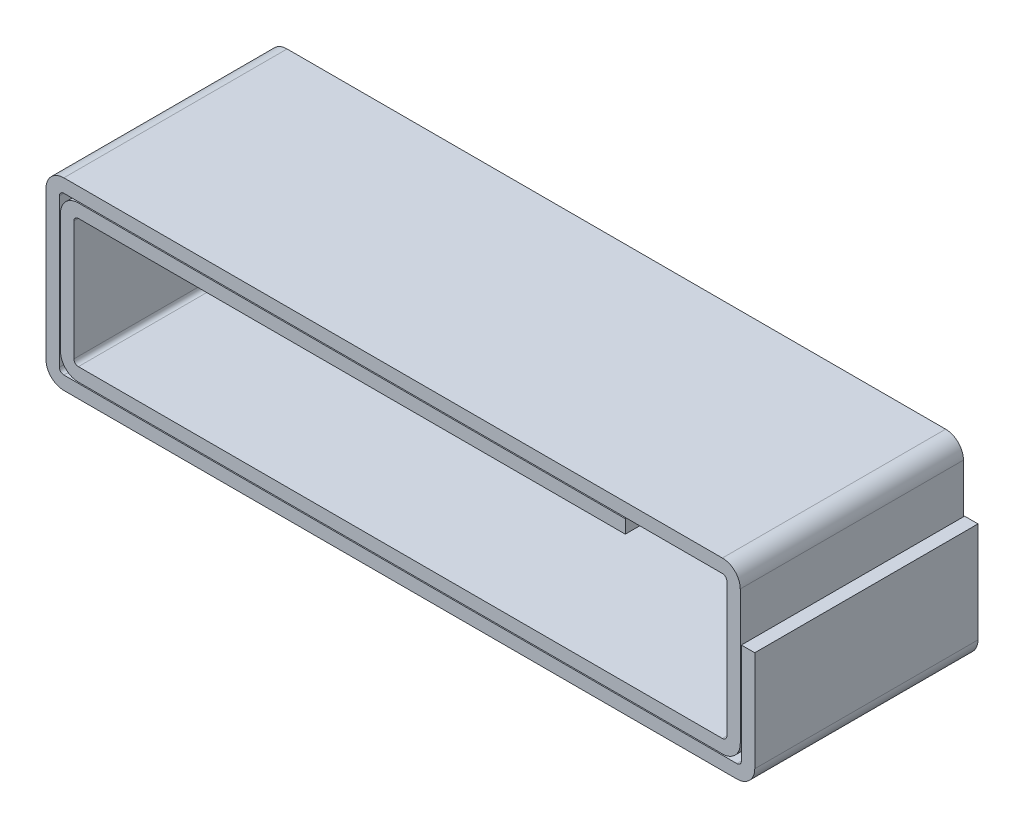
ISO-10303-21;
HEADER;
FILE_DESCRIPTION(('STEP AP214'),'2;1');
FILE_NAME('part.step','',(''),(''),'','','');
FILE_SCHEMA(('AUTOMOTIVE_DESIGN { 1 0 10303 214 1 1 1 1 }'));
ENDSEC;
DATA;
#1=APPLICATION_CONTEXT('core data for automotive mechanical design processes');
#2=APPLICATION_PROTOCOL_DEFINITION('international standard','automotive_design',2000,#1);
#3=PRODUCT_CONTEXT('',#1,'mechanical');
#4=PRODUCT('Part','Part','',(#3));
#5=PRODUCT_RELATED_PRODUCT_CATEGORY('part','',(#4));
#6=PRODUCT_DEFINITION_FORMATION('','',#4);
#7=PRODUCT_DEFINITION_CONTEXT('part definition',#1,'design');
#8=PRODUCT_DEFINITION('design','',#6,#7);
#9=PRODUCT_DEFINITION_SHAPE('','',#8);
#10=(LENGTH_UNIT() NAMED_UNIT(*) SI_UNIT(.MILLI.,.METRE.));
#11=(NAMED_UNIT(*) PLANE_ANGLE_UNIT() SI_UNIT($,.RADIAN.));
#12=(NAMED_UNIT(*) SI_UNIT($,.STERADIAN.) SOLID_ANGLE_UNIT());
#13=UNCERTAINTY_MEASURE_WITH_UNIT(LENGTH_MEASURE(1.E-05),#10,'distance_accuracy_value','');
#14=(GEOMETRIC_REPRESENTATION_CONTEXT(3) GLOBAL_UNCERTAINTY_ASSIGNED_CONTEXT((#13)) GLOBAL_UNIT_ASSIGNED_CONTEXT((#10,
#11,#12)) REPRESENTATION_CONTEXT('',''));
#15=CARTESIAN_POINT('',(0.,0.,0.));
#16=DIRECTION('',(0.,0.,1.));
#17=DIRECTION('',(1.,0.,0.));
#18=AXIS2_PLACEMENT_3D('',#15,#16,#17);
#19=CARTESIAN_POINT('',(28.85,12.9999999999999,10.));
#20=DIRECTION('',(0.,0.,-1.));
#21=DIRECTION('',(-1.,0.,0.));
#22=AXIS2_PLACEMENT_3D('',#19,#20,#21);
#23=CYLINDRICAL_SURFACE('',#22,1.6);
#24=CARTESIAN_POINT('',(28.85,12.9999999999999,-10.));
#25=DIRECTION('',(0.,0.,1.));
#26=DIRECTION('',(1.,0.,0.));
#27=AXIS2_PLACEMENT_3D('',#24,#25,#26);
#28=CIRCLE('',#27,1.6);
#29=CARTESIAN_POINT('',(30.45,13.,-10.));
#30=VERTEX_POINT('',#29);
#31=CARTESIAN_POINT('',(28.85,14.5999999999999,-10.));
#32=VERTEX_POINT('',#31);
#33=EDGE_CURVE('E290',#30,#32,#28,.T.);
#34=ORIENTED_EDGE('',*,*,#33,.T.);
#35=DIRECTION('',(0.,0.,-1.));
#36=VECTOR('',#35,1.);
#37=CARTESIAN_POINT('',(28.85,14.5999999999999,10.));
#38=LINE('',#37,#36);
#39=CARTESIAN_POINT('',(28.85,14.5999999999999,10.));
#40=VERTEX_POINT('',#39);
#41=EDGE_CURVE('E11',#40,#32,#38,.T.);
#42=ORIENTED_EDGE('',*,*,#41,.F.);
#43=CARTESIAN_POINT('',(28.85,12.9999999999999,10.));
#44=DIRECTION('',(0.,0.,1.));
#45=DIRECTION('',(1.,0.,0.));
#46=AXIS2_PLACEMENT_3D('',#43,#44,#45);
#47=CIRCLE('',#46,1.6);
#48=CARTESIAN_POINT('',(30.45,13.,10.));
#49=VERTEX_POINT('',#48);
#50=EDGE_CURVE('E403',#49,#40,#47,.T.);
#51=ORIENTED_EDGE('',*,*,#50,.F.);
#52=DIRECTION('',(0.,0.,-1.));
#53=VECTOR('',#52,1.);
#54=CARTESIAN_POINT('',(30.45,13.,10.));
#55=LINE('',#54,#53);
#56=EDGE_CURVE('E286',#49,#30,#55,.T.);
#57=ORIENTED_EDGE('',*,*,#56,.T.);
#58=EDGE_LOOP('',(#34,#42,#51,#57));
#59=FACE_BOUND('',#58,.T.);
#60=ADVANCED_FACE('F45',(#59),#23,.T.);
#61=CARTESIAN_POINT('',(28.85,14.5999999999999,10.));
#62=DIRECTION('',(0.,-1.,0.));
#63=DIRECTION('',(1.,0.,0.));
#64=AXIS2_PLACEMENT_3D('',#61,#62,#63);
#65=PLANE('',#64);
#66=DIRECTION('',(-1.,0.,0.));
#67=VECTOR('',#66,1.);
#68=CARTESIAN_POINT('',(28.85,14.5999999999999,-10.));
#69=LINE('',#68,#67);
#70=CARTESIAN_POINT('',(-30.15,14.5999999999999,-10.));
#71=VERTEX_POINT('',#70);
#72=EDGE_CURVE('E294',#32,#71,#69,.T.);
#73=ORIENTED_EDGE('',*,*,#72,.T.);
#74=DIRECTION('',(0.,0.,-1.));
#75=VECTOR('',#74,1.);
#76=CARTESIAN_POINT('',(-30.15,14.5999999999999,10.));
#77=LINE('',#76,#75);
#78=CARTESIAN_POINT('',(-30.15,14.5999999999999,10.));
#79=VERTEX_POINT('',#78);
#80=EDGE_CURVE('E54',#79,#71,#77,.T.);
#81=ORIENTED_EDGE('',*,*,#80,.F.);
#82=DIRECTION('',(-1.,0.,0.));
#83=VECTOR('',#82,1.);
#84=CARTESIAN_POINT('',(28.85,14.5999999999999,10.));
#85=LINE('',#84,#83);
#86=EDGE_CURVE('E177',#40,#79,#85,.T.);
#87=ORIENTED_EDGE('',*,*,#86,.F.);
#88=ORIENTED_EDGE('',*,*,#41,.T.);
#89=EDGE_LOOP('',(#73,#81,#87,#88));
#90=FACE_BOUND('',#89,.T.);
#91=ADVANCED_FACE('F635',(#90),#65,.F.);
#92=CARTESIAN_POINT('',(-30.15,12.9999999999999,10.));
#93=DIRECTION('',(0.,0.,-1.));
#94=DIRECTION('',(-1.,0.,0.));
#95=AXIS2_PLACEMENT_3D('',#92,#93,#94);
#96=CYLINDRICAL_SURFACE('',#95,1.6);
#97=CARTESIAN_POINT('',(-30.15,12.9999999999999,-10.));
#98=DIRECTION('',(0.,0.,1.));
#99=DIRECTION('',(1.,0.,0.));
#100=AXIS2_PLACEMENT_3D('',#97,#98,#99);
#101=CIRCLE('',#100,1.6);
#102=CARTESIAN_POINT('',(-31.75,12.9999999999999,-10.));
#103=VERTEX_POINT('',#102);
#104=EDGE_CURVE('E297',#71,#103,#101,.T.);
#105=ORIENTED_EDGE('',*,*,#104,.T.);
#106=DIRECTION('',(0.,0.,-1.));
#107=VECTOR('',#106,1.);
#108=CARTESIAN_POINT('',(-31.75,12.9999999999999,10.));
#109=LINE('',#108,#107);
#110=CARTESIAN_POINT('',(-31.75,12.9999999999999,10.));
#111=VERTEX_POINT('',#110);
#112=EDGE_CURVE('E491',#111,#103,#109,.T.);
#113=ORIENTED_EDGE('',*,*,#112,.F.);
#114=CARTESIAN_POINT('',(-30.15,12.9999999999999,10.));
#115=DIRECTION('',(0.,0.,1.));
#116=DIRECTION('',(1.,0.,0.));
#117=AXIS2_PLACEMENT_3D('',#114,#115,#116);
#118=CIRCLE('',#117,1.6);
#119=EDGE_CURVE('E501',#79,#111,#118,.T.);
#120=ORIENTED_EDGE('',*,*,#119,.F.);
#121=ORIENTED_EDGE('',*,*,#80,.T.);
#122=EDGE_LOOP('',(#105,#113,#120,#121));
#123=FACE_BOUND('',#122,.T.);
#124=ADVANCED_FACE('F499',(#123),#96,.T.);
#125=CARTESIAN_POINT('',(-31.75,12.9999999999999,10.));
#126=DIRECTION('',(1.,0.,0.));
#127=DIRECTION('',(0.,0.,-1.));
#128=AXIS2_PLACEMENT_3D('',#125,#126,#127);
#129=PLANE('',#128);
#130=DIRECTION('',(0.,-1.,0.));
#131=VECTOR('',#130,1.);
#132=CARTESIAN_POINT('',(-31.75,12.9999999999999,-10.));
#133=LINE('',#132,#131);
#134=CARTESIAN_POINT('',(-31.75,-0.3,-10.));
#135=VERTEX_POINT('',#134);
#136=EDGE_CURVE('E300',#103,#135,#133,.T.);
#137=ORIENTED_EDGE('',*,*,#136,.T.);
#138=DIRECTION('',(0.,0.,-1.));
#139=VECTOR('',#138,1.);
#140=CARTESIAN_POINT('',(-31.75,-0.3,10.));
#141=LINE('',#140,#139);
#142=CARTESIAN_POINT('',(-31.75,-0.3,10.));
#143=VERTEX_POINT('',#142);
#144=EDGE_CURVE('E487',#143,#135,#141,.T.);
#145=ORIENTED_EDGE('',*,*,#144,.F.);
#146=DIRECTION('',(0.,-1.,0.));
#147=VECTOR('',#146,1.);
#148=CARTESIAN_POINT('',(-31.75,12.9999999999999,10.));
#149=LINE('',#148,#147);
#150=EDGE_CURVE('E520',#111,#143,#149,.T.);
#151=ORIENTED_EDGE('',*,*,#150,.F.);
#152=ORIENTED_EDGE('',*,*,#112,.T.);
#153=EDGE_LOOP('',(#137,#145,#151,#152));
#154=FACE_BOUND('',#153,.T.);
#155=ADVANCED_FACE('F510',(#154),#129,.F.);
#156=CARTESIAN_POINT('',(-30.15,-0.3,10.));
#157=DIRECTION('',(0.,0.,-1.));
#158=DIRECTION('',(-1.,0.,0.));
#159=AXIS2_PLACEMENT_3D('',#156,#157,#158);
#160=CYLINDRICAL_SURFACE('',#159,1.6);
#161=CARTESIAN_POINT('',(-30.15,-0.3,-10.));
#162=DIRECTION('',(0.,0.,1.));
#163=DIRECTION('',(1.,0.,0.));
#164=AXIS2_PLACEMENT_3D('',#161,#162,#163);
#165=CIRCLE('',#164,1.6);
#166=CARTESIAN_POINT('',(-30.15,-1.9,-10.));
#167=VERTEX_POINT('',#166);
#168=EDGE_CURVE('E303',#135,#167,#165,.T.);
#169=ORIENTED_EDGE('',*,*,#168,.T.);
#170=DIRECTION('',(0.,0.,-1.));
#171=VECTOR('',#170,1.);
#172=CARTESIAN_POINT('',(-30.15,-1.9,10.));
#173=LINE('',#172,#171);
#174=CARTESIAN_POINT('',(-30.15,-1.9,10.));
#175=VERTEX_POINT('',#174);
#176=EDGE_CURVE('E483',#175,#167,#173,.T.);
#177=ORIENTED_EDGE('',*,*,#176,.F.);
#178=CARTESIAN_POINT('',(-30.15,-0.3,10.));
#179=DIRECTION('',(0.,0.,1.));
#180=DIRECTION('',(1.,0.,0.));
#181=AXIS2_PLACEMENT_3D('',#178,#179,#180);
#182=CIRCLE('',#181,1.6);
#183=EDGE_CURVE('E516',#143,#175,#182,.T.);
#184=ORIENTED_EDGE('',*,*,#183,.F.);
#185=ORIENTED_EDGE('',*,*,#144,.T.);
#186=EDGE_LOOP('',(#169,#177,#184,#185));
#187=FACE_BOUND('',#186,.T.);
#188=ADVANCED_FACE('F514',(#187),#160,.T.);
#189=CARTESIAN_POINT('',(-30.15,-1.9,10.));
#190=DIRECTION('',(0.,1.,0.));
#191=DIRECTION('',(0.,0.,1.));
#192=AXIS2_PLACEMENT_3D('',#189,#190,#191);
#193=PLANE('',#192);
#194=DIRECTION('',(1.,0.,0.));
#195=VECTOR('',#194,1.);
#196=CARTESIAN_POINT('',(-30.15,-1.9,-10.));
#197=LINE('',#196,#195);
#198=CARTESIAN_POINT('',(30.15,-1.9,-10.));
#199=VERTEX_POINT('',#198);
#200=EDGE_CURVE('E306',#167,#199,#197,.T.);
#201=ORIENTED_EDGE('',*,*,#200,.T.);
#202=DIRECTION('',(0.,0.,-1.));
#203=VECTOR('',#202,1.);
#204=CARTESIAN_POINT('',(30.15,-1.9,10.));
#205=LINE('',#204,#203);
#206=CARTESIAN_POINT('',(30.15,-1.9,10.));
#207=VERTEX_POINT('',#206);
#208=EDGE_CURVE('E479',#207,#199,#205,.T.);
#209=ORIENTED_EDGE('',*,*,#208,.F.);
#210=DIRECTION('',(1.,0.,0.));
#211=VECTOR('',#210,1.);
#212=CARTESIAN_POINT('',(-30.15,-1.9,10.));
#213=LINE('',#212,#211);
#214=EDGE_CURVE('E519',#175,#207,#213,.T.);
#215=ORIENTED_EDGE('',*,*,#214,.F.);
#216=ORIENTED_EDGE('',*,*,#176,.T.);
#217=EDGE_LOOP('',(#201,#209,#215,#216));
#218=FACE_BOUND('',#217,.T.);
#219=ADVANCED_FACE('F648',(#218),#193,.F.);
#220=CARTESIAN_POINT('',(30.15,-0.3,10.));
#221=DIRECTION('',(0.,0.,-1.));
#222=DIRECTION('',(-1.,0.,0.));
#223=AXIS2_PLACEMENT_3D('',#220,#221,#222);
#224=CYLINDRICAL_SURFACE('',#223,1.6);
#225=CARTESIAN_POINT('',(30.15,-0.3,-10.));
#226=DIRECTION('',(0.,0.,1.));
#227=DIRECTION('',(1.,0.,0.));
#228=AXIS2_PLACEMENT_3D('',#225,#226,#227);
#229=CIRCLE('',#228,1.6);
#230=CARTESIAN_POINT('',(31.75,-0.3,-10.));
#231=VERTEX_POINT('',#230);
#232=EDGE_CURVE('E309',#199,#231,#229,.T.);
#233=ORIENTED_EDGE('',*,*,#232,.T.);
#234=DIRECTION('',(0.,0.,-1.));
#235=VECTOR('',#234,1.);
#236=CARTESIAN_POINT('',(31.75,-0.3,10.));
#237=LINE('',#236,#235);
#238=CARTESIAN_POINT('',(31.75,-0.3,10.));
#239=VERTEX_POINT('',#238);
#240=EDGE_CURVE('E475',#239,#231,#237,.T.);
#241=ORIENTED_EDGE('',*,*,#240,.F.);
#242=CARTESIAN_POINT('',(30.15,-0.3,10.));
#243=DIRECTION('',(0.,0.,1.));
#244=DIRECTION('',(1.,0.,0.));
#245=AXIS2_PLACEMENT_3D('',#242,#243,#244);
#246=CIRCLE('',#245,1.6);
#247=EDGE_CURVE('E524',#207,#239,#246,.T.);
#248=ORIENTED_EDGE('',*,*,#247,.F.);
#249=ORIENTED_EDGE('',*,*,#208,.T.);
#250=EDGE_LOOP('',(#233,#241,#248,#249));
#251=FACE_BOUND('',#250,.T.);
#252=ADVANCED_FACE('F651',(#251),#224,.T.);
#253=CARTESIAN_POINT('',(31.75,-0.3,10.));
#254=DIRECTION('',(-1.,0.,0.));
#255=DIRECTION('',(0.,0.,1.));
#256=AXIS2_PLACEMENT_3D('',#253,#254,#255);
#257=PLANE('',#256);
#258=DIRECTION('',(0.,1.,0.));
#259=VECTOR('',#258,1.);
#260=CARTESIAN_POINT('',(31.75,-0.3,-10.));
#261=LINE('',#260,#259);
#262=CARTESIAN_POINT('',(31.75,8.7,-10.));
#263=VERTEX_POINT('',#262);
#264=EDGE_CURVE('E312',#231,#263,#261,.T.);
#265=ORIENTED_EDGE('',*,*,#264,.T.);
#266=DIRECTION('',(0.,0.,-1.));
#267=VECTOR('',#266,1.);
#268=CARTESIAN_POINT('',(31.75,8.7,10.));
#269=LINE('',#268,#267);
#270=CARTESIAN_POINT('',(31.75,8.7,10.));
#271=VERTEX_POINT('',#270);
#272=EDGE_CURVE('E472',#271,#263,#269,.T.);
#273=ORIENTED_EDGE('',*,*,#272,.F.);
#274=DIRECTION('',(0.,1.,0.));
#275=VECTOR('',#274,1.);
#276=CARTESIAN_POINT('',(31.75,-0.3,10.));
#277=LINE('',#276,#275);
#278=EDGE_CURVE('E531',#239,#271,#277,.T.);
#279=ORIENTED_EDGE('',*,*,#278,.F.);
#280=ORIENTED_EDGE('',*,*,#240,.T.);
#281=EDGE_LOOP('',(#265,#273,#279,#280));
#282=FACE_BOUND('',#281,.T.);
#283=ADVANCED_FACE('F655',(#282),#257,.F.);
#284=CARTESIAN_POINT('',(30.55,8.7,10.));
#285=DIRECTION('',(0.,1.,0.));
#286=DIRECTION('',(0.,0.,1.));
#287=AXIS2_PLACEMENT_3D('',#284,#285,#286);
#288=PLANE('',#287);
#289=DIRECTION('',(1.,0.,0.));
#290=VECTOR('',#289,1.);
#291=CARTESIAN_POINT('',(30.55,8.7,-10.));
#292=LINE('',#291,#290);
#293=CARTESIAN_POINT('',(30.55,8.7,-10.));
#294=VERTEX_POINT('',#293);
#295=EDGE_CURVE('E316',#294,#263,#292,.T.);
#296=ORIENTED_EDGE('',*,*,#295,.F.);
#297=DIRECTION('',(0.,0.,-1.));
#298=VECTOR('',#297,1.);
#299=CARTESIAN_POINT('',(30.55,8.7,10.));
#300=LINE('',#299,#298);
#301=CARTESIAN_POINT('',(30.55,8.7,10.));
#302=VERTEX_POINT('',#301);
#303=EDGE_CURVE('E469',#302,#294,#300,.T.);
#304=ORIENTED_EDGE('',*,*,#303,.F.);
#305=DIRECTION('',(1.,0.,0.));
#306=VECTOR('',#305,1.);
#307=CARTESIAN_POINT('',(30.55,8.7,10.));
#308=LINE('',#307,#306);
#309=EDGE_CURVE('E534',#302,#271,#308,.T.);
#310=ORIENTED_EDGE('',*,*,#309,.T.);
#311=ORIENTED_EDGE('',*,*,#272,.T.);
#312=EDGE_LOOP('',(#296,#304,#310,#311));
#313=FACE_BOUND('',#312,.T.);
#314=ADVANCED_FACE('F659',(#313),#288,.T.);
#315=CARTESIAN_POINT('',(30.55,-0.3,10.));
#316=DIRECTION('',(-1.,0.,0.));
#317=DIRECTION('',(0.,0.,1.));
#318=AXIS2_PLACEMENT_3D('',#315,#316,#317);
#319=PLANE('',#318);
#320=DIRECTION('',(0.,1.,0.));
#321=VECTOR('',#320,1.);
#322=CARTESIAN_POINT('',(30.55,-0.3,-10.));
#323=LINE('',#322,#321);
#324=CARTESIAN_POINT('',(30.55,-0.3,-10.));
#325=VERTEX_POINT('',#324);
#326=EDGE_CURVE('E320',#325,#294,#323,.T.);
#327=ORIENTED_EDGE('',*,*,#326,.F.);
#328=DIRECTION('',(0.,0.,-1.));
#329=VECTOR('',#328,1.);
#330=CARTESIAN_POINT('',(30.55,-0.3,10.));
#331=LINE('',#330,#329);
#332=CARTESIAN_POINT('',(30.55,-0.3,10.));
#333=VERTEX_POINT('',#332);
#334=EDGE_CURVE('E466',#333,#325,#331,.T.);
#335=ORIENTED_EDGE('',*,*,#334,.F.);
#336=DIRECTION('',(0.,1.,0.));
#337=VECTOR('',#336,1.);
#338=CARTESIAN_POINT('',(30.55,-0.3,10.));
#339=LINE('',#338,#337);
#340=EDGE_CURVE('E538',#333,#302,#339,.T.);
#341=ORIENTED_EDGE('',*,*,#340,.T.);
#342=ORIENTED_EDGE('',*,*,#303,.T.);
#343=EDGE_LOOP('',(#327,#335,#341,#342));
#344=FACE_BOUND('',#343,.T.);
#345=ADVANCED_FACE('F663',(#344),#319,.T.);
#346=CARTESIAN_POINT('',(30.15,-0.3,10.));
#347=DIRECTION('',(0.,0.,-1.));
#348=DIRECTION('',(-1.,0.,0.));
#349=AXIS2_PLACEMENT_3D('',#346,#347,#348);
#350=CYLINDRICAL_SURFACE('',#349,0.400000000000001);
#351=CARTESIAN_POINT('',(30.15,-0.3,-10.));
#352=DIRECTION('',(0.,0.,1.));
#353=DIRECTION('',(1.,0.,0.));
#354=AXIS2_PLACEMENT_3D('',#351,#352,#353);
#355=CIRCLE('',#354,0.400000000000001);
#356=CARTESIAN_POINT('',(30.15,-0.700000000000001,-10.));
#357=VERTEX_POINT('',#356);
#358=EDGE_CURVE('E324',#357,#325,#355,.T.);
#359=ORIENTED_EDGE('',*,*,#358,.F.);
#360=DIRECTION('',(0.,0.,-1.));
#361=VECTOR('',#360,1.);
#362=CARTESIAN_POINT('',(30.15,-0.700000000000001,10.));
#363=LINE('',#362,#361);
#364=CARTESIAN_POINT('',(30.15,-0.700000000000001,10.));
#365=VERTEX_POINT('',#364);
#366=EDGE_CURVE('E463',#365,#357,#363,.T.);
#367=ORIENTED_EDGE('',*,*,#366,.F.);
#368=CARTESIAN_POINT('',(30.15,-0.3,10.));
#369=DIRECTION('',(0.,0.,1.));
#370=DIRECTION('',(1.,0.,0.));
#371=AXIS2_PLACEMENT_3D('',#368,#369,#370);
#372=CIRCLE('',#371,0.400000000000001);
#373=EDGE_CURVE('E542',#365,#333,#372,.T.);
#374=ORIENTED_EDGE('',*,*,#373,.T.);
#375=ORIENTED_EDGE('',*,*,#334,.T.);
#376=EDGE_LOOP('',(#359,#367,#374,#375));
#377=FACE_BOUND('',#376,.T.);
#378=ADVANCED_FACE('F667',(#377),#350,.F.);
#379=CARTESIAN_POINT('',(-30.15,-0.7,10.));
#380=DIRECTION('',(0.,1.,0.));
#381=DIRECTION('',(0.,0.,1.));
#382=AXIS2_PLACEMENT_3D('',#379,#380,#381);
#383=PLANE('',#382);
#384=DIRECTION('',(1.,0.,0.));
#385=VECTOR('',#384,1.);
#386=CARTESIAN_POINT('',(-30.15,-0.7,-10.));
#387=LINE('',#386,#385);
#388=CARTESIAN_POINT('',(-30.15,-0.7,-10.));
#389=VERTEX_POINT('',#388);
#390=EDGE_CURVE('E328',#389,#357,#387,.T.);
#391=ORIENTED_EDGE('',*,*,#390,.F.);
#392=DIRECTION('',(0.,0.,-1.));
#393=VECTOR('',#392,1.);
#394=CARTESIAN_POINT('',(-30.15,-0.7,10.));
#395=LINE('',#394,#393);
#396=CARTESIAN_POINT('',(-30.15,-0.7,10.));
#397=VERTEX_POINT('',#396);
#398=EDGE_CURVE('E460',#397,#389,#395,.T.);
#399=ORIENTED_EDGE('',*,*,#398,.F.);
#400=DIRECTION('',(1.,0.,0.));
#401=VECTOR('',#400,1.);
#402=CARTESIAN_POINT('',(-30.15,-0.7,10.));
#403=LINE('',#402,#401);
#404=EDGE_CURVE('E546',#397,#365,#403,.T.);
#405=ORIENTED_EDGE('',*,*,#404,.T.);
#406=ORIENTED_EDGE('',*,*,#366,.T.);
#407=EDGE_LOOP('',(#391,#399,#405,#406));
#408=FACE_BOUND('',#407,.T.);
#409=ADVANCED_FACE('F671',(#408),#383,.T.);
#410=CARTESIAN_POINT('',(-30.15,-0.3,10.));
#411=DIRECTION('',(0.,0.,-1.));
#412=DIRECTION('',(-1.,0.,0.));
#413=AXIS2_PLACEMENT_3D('',#410,#411,#412);
#414=CYLINDRICAL_SURFACE('',#413,0.400000000000001);
#415=CARTESIAN_POINT('',(-30.15,-0.3,-10.));
#416=DIRECTION('',(0.,0.,1.));
#417=DIRECTION('',(1.,0.,0.));
#418=AXIS2_PLACEMENT_3D('',#415,#416,#417);
#419=CIRCLE('',#418,0.400000000000001);
#420=CARTESIAN_POINT('',(-30.55,-0.3,-10.));
#421=VERTEX_POINT('',#420);
#422=EDGE_CURVE('E332',#421,#389,#419,.T.);
#423=ORIENTED_EDGE('',*,*,#422,.F.);
#424=DIRECTION('',(0.,0.,-1.));
#425=VECTOR('',#424,1.);
#426=CARTESIAN_POINT('',(-30.55,-0.3,10.));
#427=LINE('',#426,#425);
#428=CARTESIAN_POINT('',(-30.55,-0.3,10.));
#429=VERTEX_POINT('',#428);
#430=EDGE_CURVE('E457',#429,#421,#427,.T.);
#431=ORIENTED_EDGE('',*,*,#430,.F.);
#432=CARTESIAN_POINT('',(-30.15,-0.3,10.));
#433=DIRECTION('',(0.,0.,1.));
#434=DIRECTION('',(1.,0.,0.));
#435=AXIS2_PLACEMENT_3D('',#432,#433,#434);
#436=CIRCLE('',#435,0.400000000000001);
#437=EDGE_CURVE('E550',#429,#397,#436,.T.);
#438=ORIENTED_EDGE('',*,*,#437,.T.);
#439=ORIENTED_EDGE('',*,*,#398,.T.);
#440=EDGE_LOOP('',(#423,#431,#438,#439));
#441=FACE_BOUND('',#440,.T.);
#442=ADVANCED_FACE('F675',(#441),#414,.F.);
#443=CARTESIAN_POINT('',(-30.55,12.9999999999999,10.));
#444=DIRECTION('',(1.,0.,0.));
#445=DIRECTION('',(0.,1.,0.));
#446=AXIS2_PLACEMENT_3D('',#443,#444,#445);
#447=PLANE('',#446);
#448=DIRECTION('',(0.,-1.,0.));
#449=VECTOR('',#448,1.);
#450=CARTESIAN_POINT('',(-30.55,12.9999999999999,-10.));
#451=LINE('',#450,#449);
#452=CARTESIAN_POINT('',(-30.55,12.9999999999999,-10.));
#453=VERTEX_POINT('',#452);
#454=EDGE_CURVE('E336',#453,#421,#451,.T.);
#455=ORIENTED_EDGE('',*,*,#454,.F.);
#456=DIRECTION('',(0.,0.,-1.));
#457=VECTOR('',#456,1.);
#458=CARTESIAN_POINT('',(-30.55,12.9999999999999,10.));
#459=LINE('',#458,#457);
#460=CARTESIAN_POINT('',(-30.55,12.9999999999999,10.));
#461=VERTEX_POINT('',#460);
#462=EDGE_CURVE('E454',#461,#453,#459,.T.);
#463=ORIENTED_EDGE('',*,*,#462,.F.);
#464=DIRECTION('',(0.,-1.,0.));
#465=VECTOR('',#464,1.);
#466=CARTESIAN_POINT('',(-30.55,12.9999999999999,10.));
#467=LINE('',#466,#465);
#468=EDGE_CURVE('E554',#461,#429,#467,.T.);
#469=ORIENTED_EDGE('',*,*,#468,.T.);
#470=ORIENTED_EDGE('',*,*,#430,.T.);
#471=EDGE_LOOP('',(#455,#463,#469,#470));
#472=FACE_BOUND('',#471,.T.);
#473=ADVANCED_FACE('F679',(#472),#447,.T.);
#474=CARTESIAN_POINT('',(-30.15,12.9999999999999,10.));
#475=DIRECTION('',(0.,0.,-1.));
#476=DIRECTION('',(-1.,0.,0.));
#477=AXIS2_PLACEMENT_3D('',#474,#475,#476);
#478=CYLINDRICAL_SURFACE('',#477,0.400000000000001);
#479=CARTESIAN_POINT('',(-30.15,12.9999999999999,-10.));
#480=DIRECTION('',(0.,0.,1.));
#481=DIRECTION('',(1.,0.,0.));
#482=AXIS2_PLACEMENT_3D('',#479,#480,#481);
#483=CIRCLE('',#482,0.400000000000001);
#484=CARTESIAN_POINT('',(-30.15,13.3999999999999,-10.));
#485=VERTEX_POINT('',#484);
#486=EDGE_CURVE('E340',#485,#453,#483,.T.);
#487=ORIENTED_EDGE('',*,*,#486,.F.);
#488=DIRECTION('',(0.,0.,-1.));
#489=VECTOR('',#488,1.);
#490=CARTESIAN_POINT('',(-30.15,13.3999999999999,10.));
#491=LINE('',#490,#489);
#492=CARTESIAN_POINT('',(-30.15,13.3999999999999,10.));
#493=VERTEX_POINT('',#492);
#494=EDGE_CURVE('E451',#493,#485,#491,.T.);
#495=ORIENTED_EDGE('',*,*,#494,.F.);
#496=CARTESIAN_POINT('',(-30.15,12.9999999999999,10.));
#497=DIRECTION('',(0.,0.,1.));
#498=DIRECTION('',(1.,0.,0.));
#499=AXIS2_PLACEMENT_3D('',#496,#497,#498);
#500=CIRCLE('',#499,0.400000000000001);
#501=EDGE_CURVE('E558',#493,#461,#500,.T.);
#502=ORIENTED_EDGE('',*,*,#501,.T.);
#503=ORIENTED_EDGE('',*,*,#462,.T.);
#504=EDGE_LOOP('',(#487,#495,#502,#503));
#505=FACE_BOUND('',#504,.T.);
#506=ADVANCED_FACE('F683',(#505),#478,.F.);
#507=CARTESIAN_POINT('',(28.85,13.3999999999999,10.));
#508=DIRECTION('',(0.,-1.,0.));
#509=DIRECTION('',(1.,0.,0.));
#510=AXIS2_PLACEMENT_3D('',#507,#508,#509);
#511=PLANE('',#510);
#512=DIRECTION('',(-1.,0.,0.));
#513=VECTOR('',#512,1.);
#514=CARTESIAN_POINT('',(28.85,13.3999999999999,-10.));
#515=LINE('',#514,#513);
#516=CARTESIAN_POINT('',(28.85,13.3999999999999,-10.));
#517=VERTEX_POINT('',#516);
#518=EDGE_CURVE('E344',#517,#485,#515,.T.);
#519=ORIENTED_EDGE('',*,*,#518,.F.);
#520=DIRECTION('',(0.,0.,-1.));
#521=VECTOR('',#520,1.);
#522=CARTESIAN_POINT('',(28.85,13.3999999999999,10.));
#523=LINE('',#522,#521);
#524=CARTESIAN_POINT('',(28.85,13.3999999999999,10.));
#525=VERTEX_POINT('',#524);
#526=EDGE_CURVE('E448',#525,#517,#523,.T.);
#527=ORIENTED_EDGE('',*,*,#526,.F.);
#528=DIRECTION('',(-1.,0.,0.));
#529=VECTOR('',#528,1.);
#530=CARTESIAN_POINT('',(28.85,13.3999999999999,10.));
#531=LINE('',#530,#529);
#532=EDGE_CURVE('E562',#525,#493,#531,.T.);
#533=ORIENTED_EDGE('',*,*,#532,.T.);
#534=ORIENTED_EDGE('',*,*,#494,.T.);
#535=EDGE_LOOP('',(#519,#527,#533,#534));
#536=FACE_BOUND('',#535,.T.);
#537=ADVANCED_FACE('F687',(#536),#511,.T.);
#538=CARTESIAN_POINT('',(28.85,12.9999999999999,10.));
#539=DIRECTION('',(0.,0.,-1.));
#540=DIRECTION('',(-1.,0.,0.));
#541=AXIS2_PLACEMENT_3D('',#538,#539,#540);
#542=CYLINDRICAL_SURFACE('',#541,0.4);
#543=CARTESIAN_POINT('',(28.85,12.9999999999999,-10.));
#544=DIRECTION('',(0.,0.,1.));
#545=DIRECTION('',(1.,0.,0.));
#546=AXIS2_PLACEMENT_3D('',#543,#544,#545);
#547=CIRCLE('',#546,0.4);
#548=CARTESIAN_POINT('',(29.25,13.,-10.));
#549=VERTEX_POINT('',#548);
#550=EDGE_CURVE('E348',#549,#517,#547,.T.);
#551=ORIENTED_EDGE('',*,*,#550,.F.);
#552=DIRECTION('',(0.,0.,-1.));
#553=VECTOR('',#552,1.);
#554=CARTESIAN_POINT('',(29.25,13.,10.));
#555=LINE('',#554,#553);
#556=CARTESIAN_POINT('',(29.25,13.,10.));
#557=VERTEX_POINT('',#556);
#558=EDGE_CURVE('E445',#557,#549,#555,.T.);
#559=ORIENTED_EDGE('',*,*,#558,.F.);
#560=CARTESIAN_POINT('',(28.85,12.9999999999999,10.));
#561=DIRECTION('',(0.,0.,1.));
#562=DIRECTION('',(1.,0.,0.));
#563=AXIS2_PLACEMENT_3D('',#560,#561,#562);
#564=CIRCLE('',#563,0.4);
#565=EDGE_CURVE('E566',#557,#525,#564,.T.);
#566=ORIENTED_EDGE('',*,*,#565,.T.);
#567=ORIENTED_EDGE('',*,*,#526,.T.);
#568=EDGE_LOOP('',(#551,#559,#566,#567));
#569=FACE_BOUND('',#568,.T.);
#570=ADVANCED_FACE('F691',(#569),#542,.F.);
#571=CARTESIAN_POINT('',(29.25,1.00000000000001,10.));
#572=DIRECTION('',(-1.,0.,0.));
#573=DIRECTION('',(0.,0.,1.));
#574=AXIS2_PLACEMENT_3D('',#571,#572,#573);
#575=PLANE('',#574);
#576=DIRECTION('',(0.,1.,0.));
#577=VECTOR('',#576,1.);
#578=CARTESIAN_POINT('',(29.25,1.00000000000001,-10.));
#579=LINE('',#578,#577);
#580=CARTESIAN_POINT('',(29.25,1.00000000000001,-10.));
#581=VERTEX_POINT('',#580);
#582=EDGE_CURVE('E352',#581,#549,#579,.T.);
#583=ORIENTED_EDGE('',*,*,#582,.F.);
#584=DIRECTION('',(0.,0.,-1.));
#585=VECTOR('',#584,1.);
#586=CARTESIAN_POINT('',(29.25,1.00000000000001,10.));
#587=LINE('',#586,#585);
#588=CARTESIAN_POINT('',(29.25,1.00000000000001,10.));
#589=VERTEX_POINT('',#588);
#590=EDGE_CURVE('E442',#589,#581,#587,.T.);
#591=ORIENTED_EDGE('',*,*,#590,.F.);
#592=DIRECTION('',(0.,1.,0.));
#593=VECTOR('',#592,1.);
#594=CARTESIAN_POINT('',(29.25,1.00000000000001,10.));
#595=LINE('',#594,#593);
#596=EDGE_CURVE('E570',#589,#557,#595,.T.);
#597=ORIENTED_EDGE('',*,*,#596,.T.);
#598=ORIENTED_EDGE('',*,*,#558,.T.);
#599=EDGE_LOOP('',(#583,#591,#597,#598));
#600=FACE_BOUND('',#599,.T.);
#601=ADVANCED_FACE('F695',(#600),#575,.T.);
#602=CARTESIAN_POINT('',(28.85,1.00000000000001,10.));
#603=DIRECTION('',(0.,0.,-1.));
#604=DIRECTION('',(-1.,0.,0.));
#605=AXIS2_PLACEMENT_3D('',#602,#603,#604);
#606=CYLINDRICAL_SURFACE('',#605,0.400000000000003);
#607=CARTESIAN_POINT('',(28.85,1.00000000000001,-10.));
#608=DIRECTION('',(0.,0.,1.));
#609=DIRECTION('',(1.,0.,0.));
#610=AXIS2_PLACEMENT_3D('',#607,#608,#609);
#611=CIRCLE('',#610,0.400000000000003);
#612=CARTESIAN_POINT('',(28.85,0.600000000000002,-10.));
#613=VERTEX_POINT('',#612);
#614=EDGE_CURVE('E356',#613,#581,#611,.T.);
#615=ORIENTED_EDGE('',*,*,#614,.F.);
#616=DIRECTION('',(0.,0.,-1.));
#617=VECTOR('',#616,1.);
#618=CARTESIAN_POINT('',(28.85,0.600000000000002,10.));
#619=LINE('',#618,#617);
#620=CARTESIAN_POINT('',(28.85,0.600000000000002,10.));
#621=VERTEX_POINT('',#620);
#622=EDGE_CURVE('E439',#621,#613,#619,.T.);
#623=ORIENTED_EDGE('',*,*,#622,.F.);
#624=CARTESIAN_POINT('',(28.85,1.00000000000001,10.));
#625=DIRECTION('',(0.,0.,1.));
#626=DIRECTION('',(1.,0.,0.));
#627=AXIS2_PLACEMENT_3D('',#624,#625,#626);
#628=CIRCLE('',#627,0.400000000000003);
#629=EDGE_CURVE('E574',#621,#589,#628,.T.);
#630=ORIENTED_EDGE('',*,*,#629,.T.);
#631=ORIENTED_EDGE('',*,*,#590,.T.);
#632=EDGE_LOOP('',(#615,#623,#630,#631));
#633=FACE_BOUND('',#632,.T.);
#634=ADVANCED_FACE('F699',(#633),#606,.F.);
#635=CARTESIAN_POINT('',(-28.85,0.600000000000005,10.));
#636=DIRECTION('',(0.,1.,0.));
#637=DIRECTION('',(-1.,0.,0.));
#638=AXIS2_PLACEMENT_3D('',#635,#636,#637);
#639=PLANE('',#638);
#640=DIRECTION('',(1.,0.,0.));
#641=VECTOR('',#640,1.);
#642=CARTESIAN_POINT('',(-28.85,0.600000000000005,-10.));
#643=LINE('',#642,#641);
#644=CARTESIAN_POINT('',(-28.85,0.600000000000005,-10.));
#645=VERTEX_POINT('',#644);
#646=EDGE_CURVE('E360',#645,#613,#643,.T.);
#647=ORIENTED_EDGE('',*,*,#646,.F.);
#648=DIRECTION('',(0.,0.,-1.));
#649=VECTOR('',#648,1.);
#650=CARTESIAN_POINT('',(-28.85,0.600000000000005,10.));
#651=LINE('',#650,#649);
#652=CARTESIAN_POINT('',(-28.85,0.600000000000005,10.));
#653=VERTEX_POINT('',#652);
#654=EDGE_CURVE('E436',#653,#645,#651,.T.);
#655=ORIENTED_EDGE('',*,*,#654,.F.);
#656=DIRECTION('',(1.,0.,0.));
#657=VECTOR('',#656,1.);
#658=CARTESIAN_POINT('',(-28.85,0.600000000000005,10.));
#659=LINE('',#658,#657);
#660=EDGE_CURVE('E578',#653,#621,#659,.T.);
#661=ORIENTED_EDGE('',*,*,#660,.T.);
#662=ORIENTED_EDGE('',*,*,#622,.T.);
#663=EDGE_LOOP('',(#647,#655,#661,#662));
#664=FACE_BOUND('',#663,.T.);
#665=ADVANCED_FACE('F703',(#664),#639,.T.);
#666=CARTESIAN_POINT('',(-28.85,1.00000000000001,10.));
#667=DIRECTION('',(0.,0.,-1.));
#668=DIRECTION('',(-1.,0.,0.));
#669=AXIS2_PLACEMENT_3D('',#666,#667,#668);
#670=CYLINDRICAL_SURFACE('',#669,0.400000000000001);
#671=CARTESIAN_POINT('',(-28.85,1.00000000000001,-10.));
#672=DIRECTION('',(0.,0.,1.));
#673=DIRECTION('',(1.,0.,0.));
#674=AXIS2_PLACEMENT_3D('',#671,#672,#673);
#675=CIRCLE('',#674,0.400000000000001);
#676=CARTESIAN_POINT('',(-29.25,1.00000000000001,-10.));
#677=VERTEX_POINT('',#676);
#678=EDGE_CURVE('E364',#677,#645,#675,.T.);
#679=ORIENTED_EDGE('',*,*,#678,.F.);
#680=DIRECTION('',(0.,0.,-1.));
#681=VECTOR('',#680,1.);
#682=CARTESIAN_POINT('',(-29.25,1.00000000000001,10.));
#683=LINE('',#682,#681);
#684=CARTESIAN_POINT('',(-29.25,1.00000000000001,10.));
#685=VERTEX_POINT('',#684);
#686=EDGE_CURVE('E433',#685,#677,#683,.T.);
#687=ORIENTED_EDGE('',*,*,#686,.F.);
#688=CARTESIAN_POINT('',(-28.85,1.00000000000001,10.));
#689=DIRECTION('',(0.,0.,1.));
#690=DIRECTION('',(1.,0.,0.));
#691=AXIS2_PLACEMENT_3D('',#688,#689,#690);
#692=CIRCLE('',#691,0.400000000000001);
#693=EDGE_CURVE('E582',#685,#653,#692,.T.);
#694=ORIENTED_EDGE('',*,*,#693,.T.);
#695=ORIENTED_EDGE('',*,*,#654,.T.);
#696=EDGE_LOOP('',(#679,#687,#694,#695));
#697=FACE_BOUND('',#696,.T.);
#698=ADVANCED_FACE('F707',(#697),#670,.F.);
#699=CARTESIAN_POINT('',(-29.25,11.7,10.));
#700=DIRECTION('',(1.,0.,0.));
#701=DIRECTION('',(0.,0.,-1.));
#702=AXIS2_PLACEMENT_3D('',#699,#700,#701);
#703=PLANE('',#702);
#704=DIRECTION('',(0.,-1.,0.));
#705=VECTOR('',#704,1.);
#706=CARTESIAN_POINT('',(-29.25,11.7,-10.));
#707=LINE('',#706,#705);
#708=CARTESIAN_POINT('',(-29.25,11.7,-10.));
#709=VERTEX_POINT('',#708);
#710=EDGE_CURVE('E368',#709,#677,#707,.T.);
#711=ORIENTED_EDGE('',*,*,#710,.F.);
#712=DIRECTION('',(0.,0.,-1.));
#713=VECTOR('',#712,1.);
#714=CARTESIAN_POINT('',(-29.25,11.7,10.));
#715=LINE('',#714,#713);
#716=CARTESIAN_POINT('',(-29.25,11.7,10.));
#717=VERTEX_POINT('',#716);
#718=EDGE_CURVE('E430',#717,#709,#715,.T.);
#719=ORIENTED_EDGE('',*,*,#718,.F.);
#720=DIRECTION('',(0.,-1.,0.));
#721=VECTOR('',#720,1.);
#722=CARTESIAN_POINT('',(-29.25,11.7,10.));
#723=LINE('',#722,#721);
#724=EDGE_CURVE('E586',#717,#685,#723,.T.);
#725=ORIENTED_EDGE('',*,*,#724,.T.);
#726=ORIENTED_EDGE('',*,*,#686,.T.);
#727=EDGE_LOOP('',(#711,#719,#725,#726));
#728=FACE_BOUND('',#727,.T.);
#729=ADVANCED_FACE('F711',(#728),#703,.T.);
#730=CARTESIAN_POINT('',(-28.85,11.7,10.));
#731=DIRECTION('',(0.,0.,-1.));
#732=DIRECTION('',(-1.,0.,0.));
#733=AXIS2_PLACEMENT_3D('',#730,#731,#732);
#734=CYLINDRICAL_SURFACE('',#733,0.400000000000001);
#735=CARTESIAN_POINT('',(-28.85,11.7,-10.));
#736=DIRECTION('',(0.,0.,-1.));
#737=DIRECTION('',(-1.,0.,0.));
#738=AXIS2_PLACEMENT_3D('',#735,#736,#737);
#739=CIRCLE('',#738,0.400000000000001);
#740=CARTESIAN_POINT('',(-28.85,12.1,-10.));
#741=VERTEX_POINT('',#740);
#742=EDGE_CURVE('E372',#709,#741,#739,.T.);
#743=ORIENTED_EDGE('',*,*,#742,.T.);
#744=DIRECTION('',(0.,0.,-1.));
#745=VECTOR('',#744,1.);
#746=CARTESIAN_POINT('',(-28.85,12.1,10.));
#747=LINE('',#746,#745);
#748=CARTESIAN_POINT('',(-28.85,12.1,10.));
#749=VERTEX_POINT('',#748);
#750=EDGE_CURVE('E426',#749,#741,#747,.T.);
#751=ORIENTED_EDGE('',*,*,#750,.F.);
#752=CARTESIAN_POINT('',(-28.85,11.7,10.));
#753=DIRECTION('',(0.,0.,-1.));
#754=DIRECTION('',(-1.,0.,0.));
#755=AXIS2_PLACEMENT_3D('',#752,#753,#754);
#756=CIRCLE('',#755,0.400000000000001);
#757=EDGE_CURVE('E590',#717,#749,#756,.T.);
#758=ORIENTED_EDGE('',*,*,#757,.F.);
#759=ORIENTED_EDGE('',*,*,#718,.T.);
#760=EDGE_LOOP('',(#743,#751,#758,#759));
#761=FACE_BOUND('',#760,.T.);
#762=ADVANCED_FACE('F715',(#761),#734,.F.);
#763=CARTESIAN_POINT('',(-28.85,12.1,10.));
#764=DIRECTION('',(0.,1.,0.));
#765=DIRECTION('',(0.,0.,1.));
#766=AXIS2_PLACEMENT_3D('',#763,#764,#765);
#767=PLANE('',#766);
#768=DIRECTION('',(1.,0.,0.));
#769=VECTOR('',#768,1.);
#770=CARTESIAN_POINT('',(-28.85,12.1,-10.));
#771=LINE('',#770,#769);
#772=CARTESIAN_POINT('',(20.15,12.1,-10.));
#773=VERTEX_POINT('',#772);
#774=EDGE_CURVE('E375',#741,#773,#771,.T.);
#775=ORIENTED_EDGE('',*,*,#774,.T.);
#776=DIRECTION('',(0.,0.,-1.));
#777=VECTOR('',#776,1.);
#778=CARTESIAN_POINT('',(20.15,12.1,10.));
#779=LINE('',#778,#777);
#780=CARTESIAN_POINT('',(20.15,12.1,10.));
#781=VERTEX_POINT('',#780);
#782=EDGE_CURVE('E423',#781,#773,#779,.T.);
#783=ORIENTED_EDGE('',*,*,#782,.F.);
#784=DIRECTION('',(1.,0.,0.));
#785=VECTOR('',#784,1.);
#786=CARTESIAN_POINT('',(-28.85,12.1,10.));
#787=LINE('',#786,#785);
#788=EDGE_CURVE('E593',#749,#781,#787,.T.);
#789=ORIENTED_EDGE('',*,*,#788,.F.);
#790=ORIENTED_EDGE('',*,*,#750,.T.);
#791=EDGE_LOOP('',(#775,#783,#789,#790));
#792=FACE_BOUND('',#791,.T.);
#793=ADVANCED_FACE('F719',(#792),#767,.F.);
#794=CARTESIAN_POINT('',(20.15,13.3,10.));
#795=DIRECTION('',(1.,0.,0.));
#796=DIRECTION('',(0.,0.,-1.));
#797=AXIS2_PLACEMENT_3D('',#794,#795,#796);
#798=PLANE('',#797);
#799=DIRECTION('',(0.,-1.,0.));
#800=VECTOR('',#799,1.);
#801=CARTESIAN_POINT('',(20.15,13.3,-10.));
#802=LINE('',#801,#800);
#803=CARTESIAN_POINT('',(20.15,13.3,-10.));
#804=VERTEX_POINT('',#803);
#805=EDGE_CURVE('E379',#804,#773,#802,.T.);
#806=ORIENTED_EDGE('',*,*,#805,.F.);
#807=DIRECTION('',(0.,0.,-1.));
#808=VECTOR('',#807,1.);
#809=CARTESIAN_POINT('',(20.15,13.3,10.));
#810=LINE('',#809,#808);
#811=CARTESIAN_POINT('',(20.15,13.3,10.));
#812=VERTEX_POINT('',#811);
#813=EDGE_CURVE('E420',#812,#804,#810,.T.);
#814=ORIENTED_EDGE('',*,*,#813,.F.);
#815=DIRECTION('',(0.,-1.,0.));
#816=VECTOR('',#815,1.);
#817=CARTESIAN_POINT('',(20.15,13.3,10.));
#818=LINE('',#817,#816);
#819=EDGE_CURVE('E596',#812,#781,#818,.T.);
#820=ORIENTED_EDGE('',*,*,#819,.T.);
#821=ORIENTED_EDGE('',*,*,#782,.T.);
#822=EDGE_LOOP('',(#806,#814,#820,#821));
#823=FACE_BOUND('',#822,.T.);
#824=ADVANCED_FACE('F723',(#823),#798,.T.);
#825=CARTESIAN_POINT('',(-28.85,13.3,10.));
#826=DIRECTION('',(0.,1.,0.));
#827=DIRECTION('',(0.,0.,1.));
#828=AXIS2_PLACEMENT_3D('',#825,#826,#827);
#829=PLANE('',#828);
#830=DIRECTION('',(1.,0.,0.));
#831=VECTOR('',#830,1.);
#832=CARTESIAN_POINT('',(-28.85,13.3,-10.));
#833=LINE('',#832,#831);
#834=CARTESIAN_POINT('',(-28.85,13.3,-10.));
#835=VERTEX_POINT('',#834);
#836=EDGE_CURVE('E383',#835,#804,#833,.T.);
#837=ORIENTED_EDGE('',*,*,#836,.F.);
#838=DIRECTION('',(0.,0.,-1.));
#839=VECTOR('',#838,1.);
#840=CARTESIAN_POINT('',(-28.85,13.3,10.));
#841=LINE('',#840,#839);
#842=CARTESIAN_POINT('',(-28.85,13.3,10.));
#843=VERTEX_POINT('',#842);
#844=EDGE_CURVE('E417',#843,#835,#841,.T.);
#845=ORIENTED_EDGE('',*,*,#844,.F.);
#846=DIRECTION('',(1.,0.,0.));
#847=VECTOR('',#846,1.);
#848=CARTESIAN_POINT('',(-28.85,13.3,10.));
#849=LINE('',#848,#847);
#850=EDGE_CURVE('E600',#843,#812,#849,.T.);
#851=ORIENTED_EDGE('',*,*,#850,.T.);
#852=ORIENTED_EDGE('',*,*,#813,.T.);
#853=EDGE_LOOP('',(#837,#845,#851,#852));
#854=FACE_BOUND('',#853,.T.);
#855=ADVANCED_FACE('F727',(#854),#829,.T.);
#856=CARTESIAN_POINT('',(-28.85,11.7,10.));
#857=DIRECTION('',(0.,0.,-1.));
#858=DIRECTION('',(-1.,0.,0.));
#859=AXIS2_PLACEMENT_3D('',#856,#857,#858);
#860=CYLINDRICAL_SURFACE('',#859,1.6);
#861=CARTESIAN_POINT('',(-28.85,11.7,-10.));
#862=DIRECTION('',(0.,0.,-1.));
#863=DIRECTION('',(-1.,0.,0.));
#864=AXIS2_PLACEMENT_3D('',#861,#862,#863);
#865=CIRCLE('',#864,1.6);
#866=CARTESIAN_POINT('',(-30.45,11.7,-10.));
#867=VERTEX_POINT('',#866);
#868=EDGE_CURVE('E387',#867,#835,#865,.T.);
#869=ORIENTED_EDGE('',*,*,#868,.F.);
#870=DIRECTION('',(0.,0.,-1.));
#871=VECTOR('',#870,1.);
#872=CARTESIAN_POINT('',(-30.45,11.7,10.));
#873=LINE('',#872,#871);
#874=CARTESIAN_POINT('',(-30.45,11.7,10.));
#875=VERTEX_POINT('',#874);
#876=EDGE_CURVE('E414',#875,#867,#873,.T.);
#877=ORIENTED_EDGE('',*,*,#876,.F.);
#878=CARTESIAN_POINT('',(-28.85,11.7,10.));
#879=DIRECTION('',(0.,0.,-1.));
#880=DIRECTION('',(-1.,0.,0.));
#881=AXIS2_PLACEMENT_3D('',#878,#879,#880);
#882=CIRCLE('',#881,1.6);
#883=EDGE_CURVE('E604',#875,#843,#882,.T.);
#884=ORIENTED_EDGE('',*,*,#883,.T.);
#885=ORIENTED_EDGE('',*,*,#844,.T.);
#886=EDGE_LOOP('',(#869,#877,#884,#885));
#887=FACE_BOUND('',#886,.T.);
#888=ADVANCED_FACE('F731',(#887),#860,.T.);
#889=CARTESIAN_POINT('',(-30.45,11.7,10.));
#890=DIRECTION('',(1.,0.,0.));
#891=DIRECTION('',(0.,0.,-1.));
#892=AXIS2_PLACEMENT_3D('',#889,#890,#891);
#893=PLANE('',#892);
#894=DIRECTION('',(0.,-1.,0.));
#895=VECTOR('',#894,1.);
#896=CARTESIAN_POINT('',(-30.45,11.7,-10.));
#897=LINE('',#896,#895);
#898=CARTESIAN_POINT('',(-30.45,1.00000000000001,-10.));
#899=VERTEX_POINT('',#898);
#900=EDGE_CURVE('E391',#867,#899,#897,.T.);
#901=ORIENTED_EDGE('',*,*,#900,.T.);
#902=DIRECTION('',(0.,0.,-1.));
#903=VECTOR('',#902,1.);
#904=CARTESIAN_POINT('',(-30.45,1.00000000000001,10.));
#905=LINE('',#904,#903);
#906=CARTESIAN_POINT('',(-30.45,1.00000000000001,10.));
#907=VERTEX_POINT('',#906);
#908=EDGE_CURVE('E410',#907,#899,#905,.T.);
#909=ORIENTED_EDGE('',*,*,#908,.F.);
#910=DIRECTION('',(0.,-1.,0.));
#911=VECTOR('',#910,1.);
#912=CARTESIAN_POINT('',(-30.45,11.7,10.));
#913=LINE('',#912,#911);
#914=EDGE_CURVE('E608',#875,#907,#913,.T.);
#915=ORIENTED_EDGE('',*,*,#914,.F.);
#916=ORIENTED_EDGE('',*,*,#876,.T.);
#917=EDGE_LOOP('',(#901,#909,#915,#916));
#918=FACE_BOUND('',#917,.T.);
#919=ADVANCED_FACE('F616',(#918),#893,.F.);
#920=CARTESIAN_POINT('',(-28.85,1.00000000000001,10.));
#921=DIRECTION('',(0.,0.,-1.));
#922=DIRECTION('',(-1.,0.,0.));
#923=AXIS2_PLACEMENT_3D('',#920,#921,#922);
#924=CYLINDRICAL_SURFACE('',#923,1.6);
#925=CARTESIAN_POINT('',(-28.85,1.00000000000001,-10.));
#926=DIRECTION('',(0.,0.,1.));
#927=DIRECTION('',(1.,0.,0.));
#928=AXIS2_PLACEMENT_3D('',#925,#926,#927);
#929=CIRCLE('',#928,1.6);
#930=CARTESIAN_POINT('',(-28.85,-0.599999999999995,-10.));
#931=VERTEX_POINT('',#930);
#932=EDGE_CURVE('E394',#899,#931,#929,.T.);
#933=ORIENTED_EDGE('',*,*,#932,.T.);
#934=DIRECTION('',(0.,0.,-1.));
#935=VECTOR('',#934,1.);
#936=CARTESIAN_POINT('',(-28.85,-0.599999999999995,10.));
#937=LINE('',#936,#935);
#938=CARTESIAN_POINT('',(-28.85,-0.599999999999995,10.));
#939=VERTEX_POINT('',#938);
#940=EDGE_CURVE('E279',#939,#931,#937,.T.);
#941=ORIENTED_EDGE('',*,*,#940,.F.);
#942=CARTESIAN_POINT('',(-28.85,1.00000000000001,10.));
#943=DIRECTION('',(0.,0.,1.));
#944=DIRECTION('',(1.,0.,0.));
#945=AXIS2_PLACEMENT_3D('',#942,#943,#944);
#946=CIRCLE('',#945,1.6);
#947=EDGE_CURVE('E268',#907,#939,#946,.T.);
#948=ORIENTED_EDGE('',*,*,#947,.F.);
#949=ORIENTED_EDGE('',*,*,#908,.T.);
#950=EDGE_LOOP('',(#933,#941,#948,#949));
#951=FACE_BOUND('',#950,.T.);
#952=ADVANCED_FACE('F620',(#951),#924,.T.);
#953=CARTESIAN_POINT('',(-28.85,-0.599999999999995,10.));
#954=DIRECTION('',(0.,1.,0.));
#955=DIRECTION('',(-1.,0.,0.));
#956=AXIS2_PLACEMENT_3D('',#953,#954,#955);
#957=PLANE('',#956);
#958=DIRECTION('',(1.,0.,0.));
#959=VECTOR('',#958,1.);
#960=CARTESIAN_POINT('',(-28.85,-0.599999999999995,-10.));
#961=LINE('',#960,#959);
#962=CARTESIAN_POINT('',(28.85,-0.6,-10.));
#963=VERTEX_POINT('',#962);
#964=EDGE_CURVE('E277',#931,#963,#961,.T.);
#965=ORIENTED_EDGE('',*,*,#964,.T.);
#966=DIRECTION('',(0.,0.,-1.));
#967=VECTOR('',#966,1.);
#968=CARTESIAN_POINT('',(28.85,-0.6,10.));
#969=LINE('',#968,#967);
#970=CARTESIAN_POINT('',(28.85,-0.6,10.));
#971=VERTEX_POINT('',#970);
#972=EDGE_CURVE('E274',#971,#963,#969,.T.);
#973=ORIENTED_EDGE('',*,*,#972,.F.);
#974=DIRECTION('',(1.,0.,0.));
#975=VECTOR('',#974,1.);
#976=CARTESIAN_POINT('',(-28.85,-0.599999999999995,10.));
#977=LINE('',#976,#975);
#978=EDGE_CURVE('E262',#939,#971,#977,.T.);
#979=ORIENTED_EDGE('',*,*,#978,.F.);
#980=ORIENTED_EDGE('',*,*,#940,.T.);
#981=EDGE_LOOP('',(#965,#973,#979,#980));
#982=FACE_BOUND('',#981,.T.);
#983=ADVANCED_FACE('F275',(#982),#957,.F.);
#984=CARTESIAN_POINT('',(28.85,1.00000000000001,10.));
#985=DIRECTION('',(0.,0.,-1.));
#986=DIRECTION('',(-1.,0.,0.));
#987=AXIS2_PLACEMENT_3D('',#984,#985,#986);
#988=CYLINDRICAL_SURFACE('',#987,1.6);
#989=CARTESIAN_POINT('',(28.85,1.00000000000001,-10.));
#990=DIRECTION('',(0.,0.,1.));
#991=DIRECTION('',(1.,0.,0.));
#992=AXIS2_PLACEMENT_3D('',#989,#990,#991);
#993=CIRCLE('',#992,1.6);
#994=CARTESIAN_POINT('',(30.45,1.00000000000001,-10.));
#995=VERTEX_POINT('',#994);
#996=EDGE_CURVE('E163',#963,#995,#993,.T.);
#997=ORIENTED_EDGE('',*,*,#996,.T.);
#998=DIRECTION('',(0.,0.,-1.));
#999=VECTOR('',#998,1.);
#1000=CARTESIAN_POINT('',(30.45,1.00000000000001,10.));
#1001=LINE('',#1000,#999);
#1002=CARTESIAN_POINT('',(30.45,1.00000000000001,10.));
#1003=VERTEX_POINT('',#1002);
#1004=EDGE_CURVE('E280',#1003,#995,#1001,.T.);
#1005=ORIENTED_EDGE('',*,*,#1004,.F.);
#1006=CARTESIAN_POINT('',(28.85,1.00000000000001,10.));
#1007=DIRECTION('',(0.,0.,1.));
#1008=DIRECTION('',(1.,0.,0.));
#1009=AXIS2_PLACEMENT_3D('',#1006,#1007,#1008);
#1010=CIRCLE('',#1009,1.6);
#1011=EDGE_CURVE('E266',#971,#1003,#1010,.T.);
#1012=ORIENTED_EDGE('',*,*,#1011,.F.);
#1013=ORIENTED_EDGE('',*,*,#972,.T.);
#1014=EDGE_LOOP('',(#997,#1005,#1012,#1013));
#1015=FACE_BOUND('',#1014,.T.);
#1016=ADVANCED_FACE('F282',(#1015),#988,.T.);
#1017=CARTESIAN_POINT('',(30.45,1.00000000000001,10.));
#1018=DIRECTION('',(-1.,0.,0.));
#1019=DIRECTION('',(0.,0.,1.));
#1020=AXIS2_PLACEMENT_3D('',#1017,#1018,#1019);
#1021=PLANE('',#1020);
#1022=DIRECTION('',(0.,1.,0.));
#1023=VECTOR('',#1022,1.);
#1024=CARTESIAN_POINT('',(30.45,1.00000000000001,-10.));
#1025=LINE('',#1024,#1023);
#1026=EDGE_CURVE('E169',#995,#30,#1025,.T.);
#1027=ORIENTED_EDGE('',*,*,#1026,.T.);
#1028=ORIENTED_EDGE('',*,*,#56,.F.);
#1029=DIRECTION('',(0.,1.,0.));
#1030=VECTOR('',#1029,1.);
#1031=CARTESIAN_POINT('',(30.45,1.00000000000001,10.));
#1032=LINE('',#1031,#1030);
#1033=EDGE_CURVE('E62',#1003,#49,#1032,.T.);
#1034=ORIENTED_EDGE('',*,*,#1033,.F.);
#1035=ORIENTED_EDGE('',*,*,#1004,.T.);
#1036=EDGE_LOOP('',(#1027,#1028,#1034,#1035));
#1037=FACE_BOUND('',#1036,.T.);
#1038=ADVANCED_FACE('F624',(#1037),#1021,.F.);
#1039=CARTESIAN_POINT('',(28.85,12.9999999999999,10.));
#1040=DIRECTION('',(0.,0.,1.));
#1041=DIRECTION('',(1.,0.,0.));
#1042=AXIS2_PLACEMENT_3D('',#1039,#1040,#1041);
#1043=PLANE('',#1042);
#1044=ORIENTED_EDGE('',*,*,#50,.T.);
#1045=ORIENTED_EDGE('',*,*,#86,.T.);
#1046=ORIENTED_EDGE('',*,*,#119,.T.);
#1047=ORIENTED_EDGE('',*,*,#150,.T.);
#1048=ORIENTED_EDGE('',*,*,#183,.T.);
#1049=ORIENTED_EDGE('',*,*,#214,.T.);
#1050=ORIENTED_EDGE('',*,*,#247,.T.);
#1051=ORIENTED_EDGE('',*,*,#278,.T.);
#1052=ORIENTED_EDGE('',*,*,#309,.F.);
#1053=ORIENTED_EDGE('',*,*,#340,.F.);
#1054=ORIENTED_EDGE('',*,*,#373,.F.);
#1055=ORIENTED_EDGE('',*,*,#404,.F.);
#1056=ORIENTED_EDGE('',*,*,#437,.F.);
#1057=ORIENTED_EDGE('',*,*,#468,.F.);
#1058=ORIENTED_EDGE('',*,*,#501,.F.);
#1059=ORIENTED_EDGE('',*,*,#532,.F.);
#1060=ORIENTED_EDGE('',*,*,#565,.F.);
#1061=ORIENTED_EDGE('',*,*,#596,.F.);
#1062=ORIENTED_EDGE('',*,*,#629,.F.);
#1063=ORIENTED_EDGE('',*,*,#660,.F.);
#1064=ORIENTED_EDGE('',*,*,#693,.F.);
#1065=ORIENTED_EDGE('',*,*,#724,.F.);
#1066=ORIENTED_EDGE('',*,*,#757,.T.);
#1067=ORIENTED_EDGE('',*,*,#788,.T.);
#1068=ORIENTED_EDGE('',*,*,#819,.F.);
#1069=ORIENTED_EDGE('',*,*,#850,.F.);
#1070=ORIENTED_EDGE('',*,*,#883,.F.);
#1071=ORIENTED_EDGE('',*,*,#914,.T.);
#1072=ORIENTED_EDGE('',*,*,#947,.T.);
#1073=ORIENTED_EDGE('',*,*,#978,.T.);
#1074=ORIENTED_EDGE('',*,*,#1011,.T.);
#1075=ORIENTED_EDGE('',*,*,#1033,.T.);
#1076=EDGE_LOOP('',(#1044,#1045,#1046,#1047,#1048,#1049,#1050,#1051,#1052,#1053,#1054,#1055,
#1056,#1057,#1058,#1059,#1060,#1061,#1062,#1063,#1064,#1065,#1066,#1067,#1068,#1069,#1070,#1071,
#1072,#1073,#1074,#1075));
#1077=FACE_BOUND('',#1076,.T.);
#1078=ADVANCED_FACE('F264',(#1077),#1043,.T.);
#1079=CARTESIAN_POINT('',(28.85,12.9999999999999,-10.));
#1080=DIRECTION('',(0.,0.,1.));
#1081=DIRECTION('',(1.,0.,0.));
#1082=AXIS2_PLACEMENT_3D('',#1079,#1080,#1081);
#1083=PLANE('',#1082);
#1084=ORIENTED_EDGE('',*,*,#33,.F.);
#1085=ORIENTED_EDGE('',*,*,#1026,.F.);
#1086=ORIENTED_EDGE('',*,*,#996,.F.);
#1087=ORIENTED_EDGE('',*,*,#964,.F.);
#1088=ORIENTED_EDGE('',*,*,#932,.F.);
#1089=ORIENTED_EDGE('',*,*,#900,.F.);
#1090=ORIENTED_EDGE('',*,*,#868,.T.);
#1091=ORIENTED_EDGE('',*,*,#836,.T.);
#1092=ORIENTED_EDGE('',*,*,#805,.T.);
#1093=ORIENTED_EDGE('',*,*,#774,.F.);
#1094=ORIENTED_EDGE('',*,*,#742,.F.);
#1095=ORIENTED_EDGE('',*,*,#710,.T.);
#1096=ORIENTED_EDGE('',*,*,#678,.T.);
#1097=ORIENTED_EDGE('',*,*,#646,.T.);
#1098=ORIENTED_EDGE('',*,*,#614,.T.);
#1099=ORIENTED_EDGE('',*,*,#582,.T.);
#1100=ORIENTED_EDGE('',*,*,#550,.T.);
#1101=ORIENTED_EDGE('',*,*,#518,.T.);
#1102=ORIENTED_EDGE('',*,*,#486,.T.);
#1103=ORIENTED_EDGE('',*,*,#454,.T.);
#1104=ORIENTED_EDGE('',*,*,#422,.T.);
#1105=ORIENTED_EDGE('',*,*,#390,.T.);
#1106=ORIENTED_EDGE('',*,*,#358,.T.);
#1107=ORIENTED_EDGE('',*,*,#326,.T.);
#1108=ORIENTED_EDGE('',*,*,#295,.T.);
#1109=ORIENTED_EDGE('',*,*,#264,.F.);
#1110=ORIENTED_EDGE('',*,*,#232,.F.);
#1111=ORIENTED_EDGE('',*,*,#200,.F.);
#1112=ORIENTED_EDGE('',*,*,#168,.F.);
#1113=ORIENTED_EDGE('',*,*,#136,.F.);
#1114=ORIENTED_EDGE('',*,*,#104,.F.);
#1115=ORIENTED_EDGE('',*,*,#72,.F.);
#1116=EDGE_LOOP('',(#1084,#1085,#1086,#1087,#1088,#1089,#1090,#1091,#1092,#1093,#1094,#1095,
#1096,#1097,#1098,#1099,#1100,#1101,#1102,#1103,#1104,#1105,#1106,#1107,#1108,#1109,#1110,#1111,
#1112,#1113,#1114,#1115));
#1117=FACE_BOUND('',#1116,.T.);
#1118=ADVANCED_FACE('F505',(#1117),#1083,.F.);
#1119=CLOSED_SHELL('',(#60,#91,#124,#155,#188,#219,#252,#283,#314,#345,#378,#409,#442,#473,#506,
#537,#570,#601,#634,#665,#698,#729,#762,#793,#824,#855,#888,#919,#952,#983,#1016,#1038,#1078,#1118));
#1120=MANIFOLD_SOLID_BREP('B2',#1119);
#1121=ADVANCED_BREP_SHAPE_REPRESENTATION('',(#18,#1120),#14);
#1122=SHAPE_DEFINITION_REPRESENTATION(#9,#1121);
ENDSEC;
END-ISO-10303-21;
